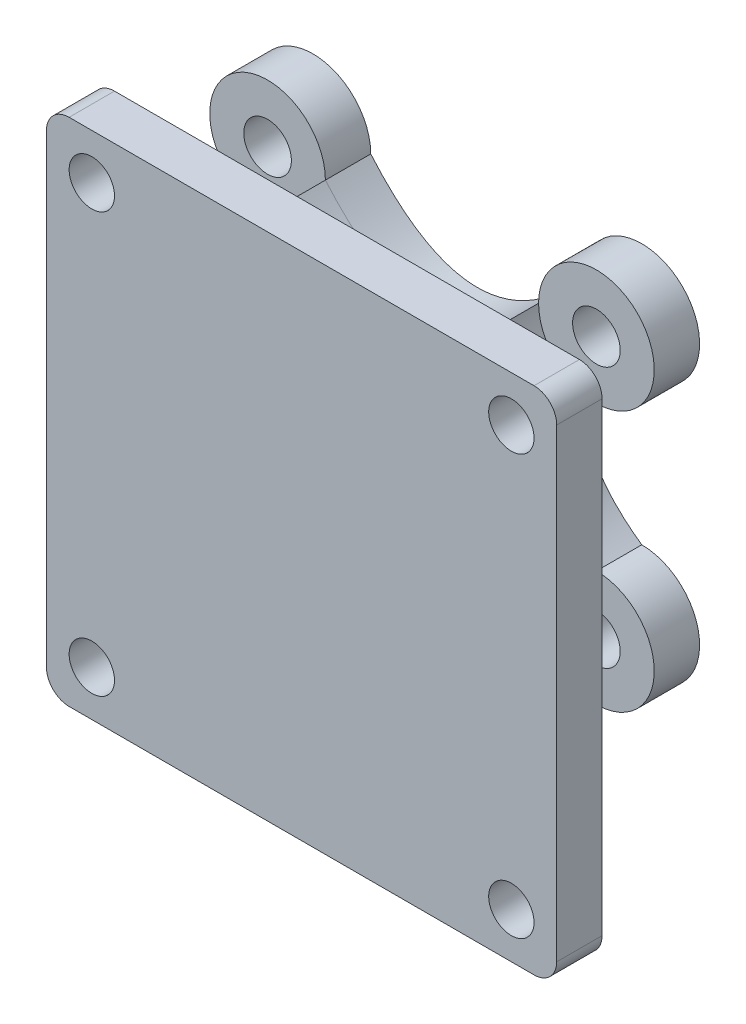
ISO-10303-21;
HEADER;
FILE_DESCRIPTION(('STEP AP214'),'2;1');
FILE_NAME('part.step','',(''),(''),'','','');
FILE_SCHEMA(('AUTOMOTIVE_DESIGN { 1 0 10303 214 1 1 1 1 }'));
ENDSEC;
DATA;
#1=APPLICATION_CONTEXT('core data for automotive mechanical design processes');
#2=APPLICATION_PROTOCOL_DEFINITION('international standard','automotive_design',2000,#1);
#3=PRODUCT_CONTEXT('',#1,'mechanical');
#4=PRODUCT('Part','Part','',(#3));
#5=PRODUCT_RELATED_PRODUCT_CATEGORY('part','',(#4));
#6=PRODUCT_DEFINITION_FORMATION('','',#4);
#7=PRODUCT_DEFINITION_CONTEXT('part definition',#1,'design');
#8=PRODUCT_DEFINITION('design','',#6,#7);
#9=PRODUCT_DEFINITION_SHAPE('','',#8);
#10=(LENGTH_UNIT() NAMED_UNIT(*) SI_UNIT(.MILLI.,.METRE.));
#11=(NAMED_UNIT(*) PLANE_ANGLE_UNIT() SI_UNIT($,.RADIAN.));
#12=(NAMED_UNIT(*) SI_UNIT($,.STERADIAN.) SOLID_ANGLE_UNIT());
#13=UNCERTAINTY_MEASURE_WITH_UNIT(LENGTH_MEASURE(1.E-05),#10,'distance_accuracy_value','');
#14=(GEOMETRIC_REPRESENTATION_CONTEXT(3) GLOBAL_UNCERTAINTY_ASSIGNED_CONTEXT((#13)) GLOBAL_UNIT_ASSIGNED_CONTEXT((#10,
#11,#12)) REPRESENTATION_CONTEXT('',''));
#15=CARTESIAN_POINT('',(0.,0.,0.));
#16=DIRECTION('',(0.,0.,1.));
#17=DIRECTION('',(1.,0.,0.));
#18=AXIS2_PLACEMENT_3D('',#15,#16,#17);
#19=CARTESIAN_POINT('',(0.,0.,4.));
#20=DIRECTION('',(0.,0.,1.));
#21=DIRECTION('',(1.,0.,0.));
#22=AXIS2_PLACEMENT_3D('',#19,#20,#21);
#23=PLANE('',#22);
#24=CARTESIAN_POINT('',(14.5,11.5,4.));
#25=DIRECTION('',(0.,0.,1.));
#26=DIRECTION('',(1.,0.,0.));
#27=AXIS2_PLACEMENT_3D('',#24,#25,#26);
#28=CIRCLE('',#27,2.1);
#29=CARTESIAN_POINT('',(16.6,11.5,4.));
#30=VERTEX_POINT('',#29);
#31=EDGE_CURVE('E265',#30,#30,#28,.T.);
#32=ORIENTED_EDGE('',*,*,#31,.F.);
#33=EDGE_LOOP('',(#32));
#34=FACE_BOUND('',#33,.T.);
#35=CARTESIAN_POINT('',(14.5,11.5,4.));
#36=DIRECTION('',(0.,0.,-1.));
#37=DIRECTION('',(1.,0.,0.));
#38=AXIS2_PLACEMENT_3D('',#35,#36,#37);
#39=CIRCLE('',#38,5.09999999093494);
#40=CARTESIAN_POINT('',(14.5,6.4,4.));
#41=VERTEX_POINT('',#40);
#42=CARTESIAN_POINT('',(9.4,11.5,4.));
#43=VERTEX_POINT('',#42);
#44=EDGE_CURVE('E124',#41,#43,#39,.T.);
#45=ORIENTED_EDGE('',*,*,#44,.F.);
#46=CARTESIAN_POINT('',(14.5,11.5,4.));
#47=DIRECTION('',(0.,0.,1.));
#48=DIRECTION('',(1.,0.,0.));
#49=AXIS2_PLACEMENT_3D('',#46,#47,#48);
#50=CIRCLE('',#49,5.1);
#51=EDGE_CURVE('E134',#41,#43,#50,.T.);
#52=ORIENTED_EDGE('',*,*,#51,.T.);
#53=EDGE_LOOP('',(#45,#52));
#54=FACE_BOUND('',#53,.T.);
#55=ADVANCED_FACE('F37',(#34,#54),#23,.T.);
#56=CARTESIAN_POINT('',(14.5,-11.5,4.));
#57=DIRECTION('',(0.,0.,1.));
#58=DIRECTION('',(1.,0.,0.));
#59=AXIS2_PLACEMENT_3D('',#56,#57,#58);
#60=CIRCLE('',#59,2.1);
#61=CARTESIAN_POINT('',(16.6,-11.5,4.));
#62=VERTEX_POINT('',#61);
#63=EDGE_CURVE('E256',#62,#62,#60,.T.);
#64=ORIENTED_EDGE('',*,*,#63,.F.);
#65=EDGE_LOOP('',(#64));
#66=FACE_BOUND('',#65,.T.);
#67=CARTESIAN_POINT('',(14.5,-11.5,4.));
#68=DIRECTION('',(0.,0.,-1.));
#69=DIRECTION('',(1.,0.,0.));
#70=AXIS2_PLACEMENT_3D('',#67,#68,#69);
#71=CIRCLE('',#70,5.10000000816288);
#72=CARTESIAN_POINT('',(9.4,-11.5,4.));
#73=VERTEX_POINT('',#72);
#74=CARTESIAN_POINT('',(14.5,-6.4,4.));
#75=VERTEX_POINT('',#74);
#76=EDGE_CURVE('E136',#73,#75,#71,.T.);
#77=ORIENTED_EDGE('',*,*,#76,.F.);
#78=CARTESIAN_POINT('',(14.5,-11.5,4.));
#79=DIRECTION('',(0.,0.,1.));
#80=DIRECTION('',(1.,0.,0.));
#81=AXIS2_PLACEMENT_3D('',#78,#79,#80);
#82=CIRCLE('',#81,5.1);
#83=EDGE_CURVE('E160',#73,#75,#82,.T.);
#84=ORIENTED_EDGE('',*,*,#83,.T.);
#85=EDGE_LOOP('',(#77,#84));
#86=FACE_BOUND('',#85,.T.);
#87=ADVANCED_FACE('F222',(#66,#86),#23,.T.);
#88=CARTESIAN_POINT('',(-14.5,-11.5,4.));
#89=DIRECTION('',(0.,0.,1.));
#90=DIRECTION('',(1.,0.,0.));
#91=AXIS2_PLACEMENT_3D('',#88,#89,#90);
#92=CIRCLE('',#91,2.1);
#93=CARTESIAN_POINT('',(-12.4,-11.5,4.));
#94=VERTEX_POINT('',#93);
#95=EDGE_CURVE('E262',#94,#94,#92,.T.);
#96=ORIENTED_EDGE('',*,*,#95,.F.);
#97=EDGE_LOOP('',(#96));
#98=FACE_BOUND('',#97,.T.);
#99=CARTESIAN_POINT('',(-14.5,-11.5,4.));
#100=DIRECTION('',(0.,0.,-1.));
#101=DIRECTION('',(1.,0.,0.));
#102=AXIS2_PLACEMENT_3D('',#99,#100,#101);
#103=CIRCLE('',#102,5.09999999093771);
#104=CARTESIAN_POINT('',(-14.5,-6.4,4.));
#105=VERTEX_POINT('',#104);
#106=CARTESIAN_POINT('',(-9.4,-11.5,4.));
#107=VERTEX_POINT('',#106);
#108=EDGE_CURVE('E391',#105,#107,#103,.T.);
#109=ORIENTED_EDGE('',*,*,#108,.F.);
#110=CARTESIAN_POINT('',(-14.5,-11.5,4.));
#111=DIRECTION('',(0.,0.,1.));
#112=DIRECTION('',(1.,0.,0.));
#113=AXIS2_PLACEMENT_3D('',#110,#111,#112);
#114=CIRCLE('',#113,5.1);
#115=EDGE_CURVE('E192',#105,#107,#114,.T.);
#116=ORIENTED_EDGE('',*,*,#115,.T.);
#117=EDGE_LOOP('',(#109,#116));
#118=FACE_BOUND('',#117,.T.);
#119=ADVANCED_FACE('F218',(#98,#118),#23,.T.);
#120=CARTESIAN_POINT('',(-14.5,11.5,4.));
#121=DIRECTION('',(0.,0.,1.));
#122=DIRECTION('',(1.,0.,0.));
#123=AXIS2_PLACEMENT_3D('',#120,#121,#122);
#124=CIRCLE('',#123,2.1);
#125=CARTESIAN_POINT('',(-12.4,11.5,4.));
#126=VERTEX_POINT('',#125);
#127=EDGE_CURVE('E317',#126,#126,#124,.T.);
#128=ORIENTED_EDGE('',*,*,#127,.F.);
#129=EDGE_LOOP('',(#128));
#130=FACE_BOUND('',#129,.T.);
#131=CARTESIAN_POINT('',(-14.5,11.5,4.));
#132=DIRECTION('',(0.,0.,-1.));
#133=DIRECTION('',(1.,0.,0.));
#134=AXIS2_PLACEMENT_3D('',#131,#132,#133);
#135=CIRCLE('',#134,5.1);
#136=CARTESIAN_POINT('',(-9.40000000000001,11.5,4.));
#137=VERTEX_POINT('',#136);
#138=CARTESIAN_POINT('',(-14.5,6.4,4.));
#139=VERTEX_POINT('',#138);
#140=EDGE_CURVE('E369',#137,#139,#135,.T.);
#141=ORIENTED_EDGE('',*,*,#140,.F.);
#142=CARTESIAN_POINT('',(-14.5,11.5,4.));
#143=DIRECTION('',(0.,0.,1.));
#144=DIRECTION('',(1.,0.,0.));
#145=AXIS2_PLACEMENT_3D('',#142,#143,#144);
#146=CIRCLE('',#145,5.1);
#147=EDGE_CURVE('E204',#137,#139,#146,.T.);
#148=ORIENTED_EDGE('',*,*,#147,.T.);
#149=EDGE_LOOP('',(#141,#148));
#150=FACE_BOUND('',#149,.T.);
#151=ADVANCED_FACE('F214',(#130,#150),#23,.T.);
#152=CARTESIAN_POINT('',(-14.5,11.5,4.));
#153=DIRECTION('',(0.,0.,-1.));
#154=DIRECTION('',(-1.,0.,0.));
#155=AXIS2_PLACEMENT_3D('',#152,#153,#154);
#156=CYLINDRICAL_SURFACE('',#155,5.1);
#157=CARTESIAN_POINT('',(-14.5,11.5,0.));
#158=DIRECTION('',(0.,0.,1.));
#159=DIRECTION('',(1.,0.,0.));
#160=AXIS2_PLACEMENT_3D('',#157,#158,#159);
#161=CIRCLE('',#160,5.1);
#162=CARTESIAN_POINT('',(-9.40000000000001,11.5,0.));
#163=VERTEX_POINT('',#162);
#164=CARTESIAN_POINT('',(-14.5,6.4,0.));
#165=VERTEX_POINT('',#164);
#166=EDGE_CURVE('E271',#163,#165,#161,.T.);
#167=ORIENTED_EDGE('',*,*,#166,.T.);
#168=DIRECTION('',(0.,0.,-1.));
#169=VECTOR('',#168,1.);
#170=CARTESIAN_POINT('',(-14.5,6.4,4.));
#171=LINE('',#170,#169);
#172=EDGE_CURVE('E45',#139,#165,#171,.T.);
#173=ORIENTED_EDGE('',*,*,#172,.F.);
#174=ORIENTED_EDGE('',*,*,#147,.F.);
#175=DIRECTION('',(0.,0.,-1.));
#176=VECTOR('',#175,1.);
#177=CARTESIAN_POINT('',(-9.40000000000001,11.5,4.));
#178=LINE('',#177,#176);
#179=EDGE_CURVE('E95',#137,#163,#178,.T.);
#180=ORIENTED_EDGE('',*,*,#179,.T.);
#181=EDGE_LOOP('',(#167,#173,#174,#180));
#182=FACE_BOUND('',#181,.T.);
#183=ADVANCED_FACE('F211',(#182),#156,.T.);
#184=CARTESIAN_POINT('',(-14.5,6.4,4.));
#185=CARTESIAN_POINT('',(-5.5,0.,4.));
#186=CARTESIAN_POINT('',(-14.5,-6.4,4.));
#187=B_SPLINE_CURVE_WITH_KNOTS('',2,(#184,#185,#186),.UNSPECIFIED.,.F.,.F.,(3,3),(0.,1.),.UNSPECIFIED.);
#188=DIRECTION('',(0.,0.,-1.));
#189=VECTOR('',#188,1.);
#190=SURFACE_OF_LINEAR_EXTRUSION('',#187,#189);
#191=CARTESIAN_POINT('',(-14.5,6.4,0.));
#192=CARTESIAN_POINT('',(-5.5,0.,0.));
#193=CARTESIAN_POINT('',(-14.5,-6.4,0.));
#194=B_SPLINE_CURVE_WITH_KNOTS('',2,(#191,#192,#193),.UNSPECIFIED.,.F.,.F.,(3,3),(0.,1.),.UNSPECIFIED.);
#195=CARTESIAN_POINT('',(-14.5,-6.4,0.));
#196=VERTEX_POINT('',#195);
#197=EDGE_CURVE('E273',#165,#196,#194,.T.);
#198=ORIENTED_EDGE('',*,*,#197,.T.);
#199=DIRECTION('',(0.,0.,-1.));
#200=VECTOR('',#199,1.);
#201=CARTESIAN_POINT('',(-14.5,-6.4,4.));
#202=LINE('',#201,#200);
#203=EDGE_CURVE('E327',#105,#196,#202,.T.);
#204=ORIENTED_EDGE('',*,*,#203,.F.);
#205=EDGE_CURVE('E198',#139,#105,#187,.T.);
#206=ORIENTED_EDGE('',*,*,#205,.F.);
#207=ORIENTED_EDGE('',*,*,#172,.T.);
#208=EDGE_LOOP('',(#198,#204,#206,#207));
#209=FACE_BOUND('',#208,.T.);
#210=ADVANCED_FACE('F209',(#209),#190,.F.);
#211=CARTESIAN_POINT('',(-14.5,-11.5,4.));
#212=DIRECTION('',(0.,0.,-1.));
#213=DIRECTION('',(-1.,0.,0.));
#214=AXIS2_PLACEMENT_3D('',#211,#212,#213);
#215=CYLINDRICAL_SURFACE('',#214,5.1);
#216=CARTESIAN_POINT('',(-14.5,-11.5,0.));
#217=DIRECTION('',(0.,0.,1.));
#218=DIRECTION('',(1.,0.,0.));
#219=AXIS2_PLACEMENT_3D('',#216,#217,#218);
#220=CIRCLE('',#219,5.1);
#221=CARTESIAN_POINT('',(-9.4,-11.5,0.));
#222=VERTEX_POINT('',#221);
#223=EDGE_CURVE('E277',#196,#222,#220,.T.);
#224=ORIENTED_EDGE('',*,*,#223,.T.);
#225=DIRECTION('',(0.,0.,-1.));
#226=VECTOR('',#225,1.);
#227=CARTESIAN_POINT('',(-9.4,-11.5,4.));
#228=LINE('',#227,#226);
#229=EDGE_CURVE('E324',#107,#222,#228,.T.);
#230=ORIENTED_EDGE('',*,*,#229,.F.);
#231=ORIENTED_EDGE('',*,*,#115,.F.);
#232=ORIENTED_EDGE('',*,*,#203,.T.);
#233=EDGE_LOOP('',(#224,#230,#231,#232));
#234=FACE_BOUND('',#233,.T.);
#235=ADVANCED_FACE('F184',(#234),#215,.T.);
#236=CARTESIAN_POINT('',(-9.4,-11.5,4.));
#237=CARTESIAN_POINT('',(0.,-0.499999999999993,4.));
#238=CARTESIAN_POINT('',(9.4,-11.5,4.));
#239=B_SPLINE_CURVE_WITH_KNOTS('',2,(#236,#237,#238),.UNSPECIFIED.,.F.,.F.,(3,3),(0.,1.),.UNSPECIFIED.);
#240=DIRECTION('',(0.,0.,-1.));
#241=VECTOR('',#240,1.);
#242=SURFACE_OF_LINEAR_EXTRUSION('',#239,#241);
#243=CARTESIAN_POINT('',(-9.4,-11.5,0.));
#244=CARTESIAN_POINT('',(0.,-0.499999999999993,0.));
#245=CARTESIAN_POINT('',(9.4,-11.5,0.));
#246=B_SPLINE_CURVE_WITH_KNOTS('',2,(#243,#244,#245),.UNSPECIFIED.,.F.,.F.,(3,3),(0.,1.),.UNSPECIFIED.);
#247=CARTESIAN_POINT('',(9.4,-11.5,0.));
#248=VERTEX_POINT('',#247);
#249=EDGE_CURVE('E282',#222,#248,#246,.T.);
#250=ORIENTED_EDGE('',*,*,#249,.T.);
#251=DIRECTION('',(0.,0.,-1.));
#252=VECTOR('',#251,1.);
#253=CARTESIAN_POINT('',(9.4,-11.5,4.));
#254=LINE('',#253,#252);
#255=EDGE_CURVE('E321',#73,#248,#254,.T.);
#256=ORIENTED_EDGE('',*,*,#255,.F.);
#257=EDGE_CURVE('E162',#107,#73,#239,.T.);
#258=ORIENTED_EDGE('',*,*,#257,.F.);
#259=ORIENTED_EDGE('',*,*,#229,.T.);
#260=EDGE_LOOP('',(#250,#256,#258,#259));
#261=FACE_BOUND('',#260,.T.);
#262=ADVANCED_FACE('F180',(#261),#242,.F.);
#263=CARTESIAN_POINT('',(14.5,-11.5,4.));
#264=DIRECTION('',(0.,0.,-1.));
#265=DIRECTION('',(-1.,0.,0.));
#266=AXIS2_PLACEMENT_3D('',#263,#264,#265);
#267=CYLINDRICAL_SURFACE('',#266,5.1);
#268=CARTESIAN_POINT('',(14.5,-11.5,0.));
#269=DIRECTION('',(0.,0.,1.));
#270=DIRECTION('',(1.,0.,0.));
#271=AXIS2_PLACEMENT_3D('',#268,#269,#270);
#272=CIRCLE('',#271,5.1);
#273=CARTESIAN_POINT('',(14.5,-6.4,0.));
#274=VERTEX_POINT('',#273);
#275=EDGE_CURVE('E286',#248,#274,#272,.T.);
#276=ORIENTED_EDGE('',*,*,#275,.T.);
#277=DIRECTION('',(0.,0.,-1.));
#278=VECTOR('',#277,1.);
#279=CARTESIAN_POINT('',(14.5,-6.4,4.));
#280=LINE('',#279,#278);
#281=EDGE_CURVE('E150',#75,#274,#280,.T.);
#282=ORIENTED_EDGE('',*,*,#281,.F.);
#283=ORIENTED_EDGE('',*,*,#83,.F.);
#284=ORIENTED_EDGE('',*,*,#255,.T.);
#285=EDGE_LOOP('',(#276,#282,#283,#284));
#286=FACE_BOUND('',#285,.T.);
#287=ADVANCED_FACE('F176',(#286),#267,.T.);
#288=CARTESIAN_POINT('',(14.5,6.4,4.));
#289=CARTESIAN_POINT('',(5.49999999999999,0.,4.));
#290=CARTESIAN_POINT('',(14.5,-6.39999999999999,4.));
#291=B_SPLINE_CURVE_WITH_KNOTS('',2,(#288,#289,#290),.UNSPECIFIED.,.F.,.F.,(3,3),(0.,1.),.UNSPECIFIED.);
#292=DIRECTION('',(0.,0.,-1.));
#293=VECTOR('',#292,1.);
#294=SURFACE_OF_LINEAR_EXTRUSION('',#291,#293);
#295=CARTESIAN_POINT('',(14.5,6.4,0.));
#296=CARTESIAN_POINT('',(5.49999999999999,0.,0.));
#297=CARTESIAN_POINT('',(14.5,-6.39999999999999,0.));
#298=B_SPLINE_CURVE_WITH_KNOTS('',2,(#295,#296,#297),.UNSPECIFIED.,.F.,.F.,(3,3),(0.,1.),.UNSPECIFIED.);
#299=CARTESIAN_POINT('',(14.5,6.4,0.));
#300=VERTEX_POINT('',#299);
#301=EDGE_CURVE('E146',#300,#274,#298,.T.);
#302=ORIENTED_EDGE('',*,*,#301,.F.);
#303=DIRECTION('',(0.,0.,-1.));
#304=VECTOR('',#303,1.);
#305=CARTESIAN_POINT('',(14.5,6.4,4.));
#306=LINE('',#305,#304);
#307=EDGE_CURVE('E141',#41,#300,#306,.T.);
#308=ORIENTED_EDGE('',*,*,#307,.F.);
#309=EDGE_CURVE('E143',#41,#75,#291,.T.);
#310=ORIENTED_EDGE('',*,*,#309,.T.);
#311=ORIENTED_EDGE('',*,*,#281,.T.);
#312=EDGE_LOOP('',(#302,#308,#310,#311));
#313=FACE_BOUND('',#312,.T.);
#314=ADVANCED_FACE('F142',(#313),#294,.T.);
#315=CARTESIAN_POINT('',(14.5,11.5,4.));
#316=DIRECTION('',(0.,0.,-1.));
#317=DIRECTION('',(-1.,0.,0.));
#318=AXIS2_PLACEMENT_3D('',#315,#316,#317);
#319=CYLINDRICAL_SURFACE('',#318,5.1);
#320=CARTESIAN_POINT('',(14.5,11.5,0.));
#321=DIRECTION('',(0.,0.,1.));
#322=DIRECTION('',(1.,0.,0.));
#323=AXIS2_PLACEMENT_3D('',#320,#321,#322);
#324=CIRCLE('',#323,5.1);
#325=CARTESIAN_POINT('',(9.4,11.5,0.));
#326=VERTEX_POINT('',#325);
#327=EDGE_CURVE('E295',#300,#326,#324,.T.);
#328=ORIENTED_EDGE('',*,*,#327,.T.);
#329=DIRECTION('',(0.,0.,-1.));
#330=VECTOR('',#329,1.);
#331=CARTESIAN_POINT('',(9.4,11.5,4.));
#332=LINE('',#331,#330);
#333=EDGE_CURVE('E151',#43,#326,#332,.T.);
#334=ORIENTED_EDGE('',*,*,#333,.F.);
#335=ORIENTED_EDGE('',*,*,#51,.F.);
#336=ORIENTED_EDGE('',*,*,#307,.T.);
#337=EDGE_LOOP('',(#328,#334,#335,#336));
#338=FACE_BOUND('',#337,.T.);
#339=ADVANCED_FACE('F153',(#338),#319,.T.);
#340=CARTESIAN_POINT('',(-14.5,-11.5,4.));
#341=DIRECTION('',(0.,0.,-1.));
#342=DIRECTION('',(-1.,0.,0.));
#343=AXIS2_PLACEMENT_3D('',#340,#341,#342);
#344=CYLINDRICAL_SURFACE('',#343,2.1);
#345=ORIENTED_EDGE('',*,*,#95,.T.);
#346=EDGE_LOOP('',(#345));
#347=FACE_BOUND('',#346,.T.);
#348=CARTESIAN_POINT('',(-14.5,-11.5,0.));
#349=DIRECTION('',(0.,0.,1.));
#350=DIRECTION('',(1.,0.,0.));
#351=AXIS2_PLACEMENT_3D('',#348,#349,#350);
#352=CIRCLE('',#351,2.1);
#353=CARTESIAN_POINT('',(-12.4,-11.5,0.));
#354=VERTEX_POINT('',#353);
#355=EDGE_CURVE('E311',#354,#354,#352,.T.);
#356=ORIENTED_EDGE('',*,*,#355,.F.);
#357=EDGE_LOOP('',(#356));
#358=FACE_BOUND('',#357,.T.);
#359=ADVANCED_FACE('F242',(#347,#358),#344,.F.);
#360=CARTESIAN_POINT('',(14.5,-11.5,4.));
#361=DIRECTION('',(0.,0.,-1.));
#362=DIRECTION('',(-1.,0.,0.));
#363=AXIS2_PLACEMENT_3D('',#360,#361,#362);
#364=CYLINDRICAL_SURFACE('',#363,2.1);
#365=ORIENTED_EDGE('',*,*,#63,.T.);
#366=EDGE_LOOP('',(#365));
#367=FACE_BOUND('',#366,.T.);
#368=CARTESIAN_POINT('',(14.5,-11.5,0.));
#369=DIRECTION('',(0.,0.,1.));
#370=DIRECTION('',(1.,0.,0.));
#371=AXIS2_PLACEMENT_3D('',#368,#369,#370);
#372=CIRCLE('',#371,2.1);
#373=CARTESIAN_POINT('',(16.6,-11.5,0.));
#374=VERTEX_POINT('',#373);
#375=EDGE_CURVE('E305',#374,#374,#372,.T.);
#376=ORIENTED_EDGE('',*,*,#375,.F.);
#377=EDGE_LOOP('',(#376));
#378=FACE_BOUND('',#377,.T.);
#379=ADVANCED_FACE('F245',(#367,#378),#364,.F.);
#380=CARTESIAN_POINT('',(-9.4,11.5,4.));
#381=CARTESIAN_POINT('',(0.,0.5,4.));
#382=CARTESIAN_POINT('',(9.4,11.5,4.));
#383=B_SPLINE_CURVE_WITH_KNOTS('',2,(#380,#381,#382),.UNSPECIFIED.,.F.,.F.,(3,3),(0.,1.),.UNSPECIFIED.);
#384=DIRECTION('',(0.,0.,-1.));
#385=VECTOR('',#384,1.);
#386=SURFACE_OF_LINEAR_EXTRUSION('',#383,#385);
#387=CARTESIAN_POINT('',(-9.4,11.5,0.));
#388=CARTESIAN_POINT('',(0.,0.5,0.));
#389=CARTESIAN_POINT('',(9.4,11.5,0.));
#390=B_SPLINE_CURVE_WITH_KNOTS('',2,(#387,#388,#389),.UNSPECIFIED.,.F.,.F.,(3,3),(0.,1.),.UNSPECIFIED.);
#391=EDGE_CURVE('E300',#163,#326,#390,.T.);
#392=ORIENTED_EDGE('',*,*,#391,.F.);
#393=ORIENTED_EDGE('',*,*,#179,.F.);
#394=EDGE_CURVE('E155',#137,#43,#383,.T.);
#395=ORIENTED_EDGE('',*,*,#394,.T.);
#396=ORIENTED_EDGE('',*,*,#333,.T.);
#397=EDGE_LOOP('',(#392,#393,#395,#396));
#398=FACE_BOUND('',#397,.T.);
#399=ADVANCED_FACE('F248',(#398),#386,.T.);
#400=CARTESIAN_POINT('',(-14.5,11.5,4.));
#401=DIRECTION('',(0.,0.,-1.));
#402=DIRECTION('',(-1.,0.,0.));
#403=AXIS2_PLACEMENT_3D('',#400,#401,#402);
#404=CYLINDRICAL_SURFACE('',#403,2.1);
#405=ORIENTED_EDGE('',*,*,#127,.T.);
#406=EDGE_LOOP('',(#405));
#407=FACE_BOUND('',#406,.T.);
#408=CARTESIAN_POINT('',(-14.5,11.5,0.));
#409=DIRECTION('',(0.,0.,1.));
#410=DIRECTION('',(1.,0.,0.));
#411=AXIS2_PLACEMENT_3D('',#408,#409,#410);
#412=CIRCLE('',#411,2.1);
#413=CARTESIAN_POINT('',(-12.4,11.5,0.));
#414=VERTEX_POINT('',#413);
#415=EDGE_CURVE('E268',#414,#414,#412,.T.);
#416=ORIENTED_EDGE('',*,*,#415,.F.);
#417=EDGE_LOOP('',(#416));
#418=FACE_BOUND('',#417,.T.);
#419=ADVANCED_FACE('F39',(#407,#418),#404,.F.);
#420=CARTESIAN_POINT('',(14.5,11.5,4.));
#421=DIRECTION('',(0.,0.,-1.));
#422=DIRECTION('',(-1.,0.,0.));
#423=AXIS2_PLACEMENT_3D('',#420,#421,#422);
#424=CYLINDRICAL_SURFACE('',#423,2.1);
#425=ORIENTED_EDGE('',*,*,#31,.T.);
#426=EDGE_LOOP('',(#425));
#427=FACE_BOUND('',#426,.T.);
#428=CARTESIAN_POINT('',(14.5,11.5,0.));
#429=DIRECTION('',(0.,0.,1.));
#430=DIRECTION('',(1.,0.,0.));
#431=AXIS2_PLACEMENT_3D('',#428,#429,#430);
#432=CIRCLE('',#431,2.1);
#433=CARTESIAN_POINT('',(16.6,11.5,0.));
#434=VERTEX_POINT('',#433);
#435=EDGE_CURVE('E314',#434,#434,#432,.T.);
#436=ORIENTED_EDGE('',*,*,#435,.F.);
#437=EDGE_LOOP('',(#436));
#438=FACE_BOUND('',#437,.T.);
#439=ADVANCED_FACE('F237',(#427,#438),#424,.F.);
#440=CARTESIAN_POINT('',(0.,0.,0.));
#441=DIRECTION('',(0.,0.,1.));
#442=DIRECTION('',(1.,0.,0.));
#443=AXIS2_PLACEMENT_3D('',#440,#441,#442);
#444=PLANE('',#443);
#445=ORIENTED_EDGE('',*,*,#415,.T.);
#446=EDGE_LOOP('',(#445));
#447=FACE_BOUND('',#446,.T.);
#448=ORIENTED_EDGE('',*,*,#166,.F.);
#449=ORIENTED_EDGE('',*,*,#391,.T.);
#450=ORIENTED_EDGE('',*,*,#327,.F.);
#451=ORIENTED_EDGE('',*,*,#301,.T.);
#452=ORIENTED_EDGE('',*,*,#275,.F.);
#453=ORIENTED_EDGE('',*,*,#249,.F.);
#454=ORIENTED_EDGE('',*,*,#223,.F.);
#455=ORIENTED_EDGE('',*,*,#197,.F.);
#456=EDGE_LOOP('',(#448,#449,#450,#451,#452,#453,#454,#455));
#457=FACE_BOUND('',#456,.T.);
#458=ORIENTED_EDGE('',*,*,#375,.T.);
#459=EDGE_LOOP('',(#458));
#460=FACE_BOUND('',#459,.T.);
#461=ORIENTED_EDGE('',*,*,#355,.T.);
#462=EDGE_LOOP('',(#461));
#463=FACE_BOUND('',#462,.T.);
#464=ORIENTED_EDGE('',*,*,#435,.T.);
#465=EDGE_LOOP('',(#464));
#466=FACE_BOUND('',#465,.T.);
#467=ADVANCED_FACE('F234',(#447,#457,#460,#463,#466),#444,.F.);
#468=CARTESIAN_POINT('',(4008.17346747329,1000006.,15.5));
#469=CARTESIAN_POINT('',(2.37143638059933E-10,-999994.,15.5));
#470=CARTESIAN_POINT('',(-4008.17346747376,1000006.,15.5));
#471=B_SPLINE_CURVE_WITH_KNOTS('',2,(#468,#469,#470),.UNSPECIFIED.,.F.,.F.,(3,3),(0.,1.),.UNSPECIFIED.);
#472=DIRECTION('',(0.,0.,-1.));
#473=VECTOR('',#472,1.);
#474=SURFACE_OF_LINEAR_EXTRUSION('',#471,#473);
#475=DIRECTION('',(0.,0.,-1.));
#476=VECTOR('',#475,1.);
#477=CARTESIAN_POINT('',(-9.40000000000001,11.5,15.5));
#478=LINE('',#477,#476);
#479=CARTESIAN_POINT('',(-9.40000000000001,11.5,11.5));
#480=VERTEX_POINT('',#479);
#481=EDGE_CURVE('E60',#480,#137,#478,.T.);
#482=ORIENTED_EDGE('',*,*,#481,.F.);
#483=CARTESIAN_POINT('',(4008.17346747329,1000006.,11.5));
#484=CARTESIAN_POINT('',(2.37143638059933E-10,-999994.,11.5));
#485=CARTESIAN_POINT('',(-4008.17346747376,1000006.,11.5));
#486=B_SPLINE_CURVE_WITH_KNOTS('',2,(#483,#484,#485),.UNSPECIFIED.,.F.,.F.,(3,3),(0.,1.),.UNSPECIFIED.);
#487=CARTESIAN_POINT('',(9.40000000906506,11.5,11.5));
#488=VERTEX_POINT('',#487);
#489=EDGE_CURVE('E374',#480,#488,#486,.F.);
#490=ORIENTED_EDGE('',*,*,#489,.T.);
#491=DIRECTION('',(0.,0.,-1.));
#492=VECTOR('',#491,1.);
#493=CARTESIAN_POINT('',(9.40000000906506,11.5,15.5));
#494=LINE('',#493,#492);
#495=EDGE_CURVE('E128',#488,#43,#494,.T.);
#496=ORIENTED_EDGE('',*,*,#495,.T.);
#497=ORIENTED_EDGE('',*,*,#394,.F.);
#498=EDGE_LOOP('',(#482,#490,#496,#497));
#499=FACE_BOUND('',#498,.T.);
#500=ADVANCED_FACE('F231',(#499),#474,.F.);
#501=CARTESIAN_POINT('',(-14.5,11.5,15.5));
#502=DIRECTION('',(0.,0.,-1.));
#503=DIRECTION('',(-1.,0.,0.));
#504=AXIS2_PLACEMENT_3D('',#501,#502,#503);
#505=CYLINDRICAL_SURFACE('',#504,5.1);
#506=DIRECTION('',(0.,0.,-1.));
#507=VECTOR('',#506,1.);
#508=CARTESIAN_POINT('',(-14.5,6.4,15.5));
#509=LINE('',#508,#507);
#510=CARTESIAN_POINT('',(-14.5000000000262,6.39999999996288,11.5));
#511=VERTEX_POINT('',#510);
#512=EDGE_CURVE('E355',#511,#139,#509,.T.);
#513=ORIENTED_EDGE('',*,*,#512,.F.);
#514=CARTESIAN_POINT('',(-14.5,11.5,11.5));
#515=DIRECTION('',(0.,0.,-1.));
#516=DIRECTION('',(-1.,0.,0.));
#517=AXIS2_PLACEMENT_3D('',#514,#515,#516);
#518=CIRCLE('',#517,5.1);
#519=EDGE_CURVE('E401',#511,#480,#518,.F.);
#520=ORIENTED_EDGE('',*,*,#519,.T.);
#521=ORIENTED_EDGE('',*,*,#481,.T.);
#522=ORIENTED_EDGE('',*,*,#140,.T.);
#523=EDGE_LOOP('',(#513,#520,#521,#522));
#524=FACE_BOUND('',#523,.T.);
#525=ADVANCED_FACE('F403',(#524),#505,.F.);
#526=CARTESIAN_POINT('',(-1000010.,3016.98893305878,15.5));
#527=CARTESIAN_POINT('',(999990.,-3.50386386571699E-10,15.5));
#528=CARTESIAN_POINT('',(-1000010.,-3016.98893305813,15.5));
#529=B_SPLINE_CURVE_WITH_KNOTS('',2,(#526,#527,#528),.UNSPECIFIED.,.F.,.F.,(3,3),(0.,1.),.UNSPECIFIED.);
#530=DIRECTION('',(0.,0.,-1.));
#531=VECTOR('',#530,1.);
#532=SURFACE_OF_LINEAR_EXTRUSION('',#529,#531);
#533=DIRECTION('',(0.,0.,-1.));
#534=VECTOR('',#533,1.);
#535=CARTESIAN_POINT('',(-14.500000050955,-6.40000003620489,15.5));
#536=LINE('',#535,#534);
#537=CARTESIAN_POINT('',(-14.500000050955,-6.40000000906229,11.5));
#538=VERTEX_POINT('',#537);
#539=EDGE_CURVE('E104',#538,#105,#536,.T.);
#540=ORIENTED_EDGE('',*,*,#539,.F.);
#541=CARTESIAN_POINT('',(-1000010.,3016.98893305878,11.5));
#542=CARTESIAN_POINT('',(999990.,-3.50386386571699E-10,11.5));
#543=CARTESIAN_POINT('',(-1000010.,-3016.98893305813,11.5));
#544=B_SPLINE_CURVE_WITH_KNOTS('',2,(#541,#542,#543),.UNSPECIFIED.,.F.,.F.,(3,3),(0.,1.),.UNSPECIFIED.);
#545=EDGE_CURVE('E358',#538,#511,#544,.F.);
#546=ORIENTED_EDGE('',*,*,#545,.T.);
#547=ORIENTED_EDGE('',*,*,#512,.T.);
#548=ORIENTED_EDGE('',*,*,#205,.T.);
#549=EDGE_LOOP('',(#540,#546,#547,#548));
#550=FACE_BOUND('',#549,.T.);
#551=ADVANCED_FACE('F351',(#550),#532,.F.);
#552=CARTESIAN_POINT('',(-14.5,-11.5,15.5));
#553=DIRECTION('',(0.,0.,-1.));
#554=DIRECTION('',(-1.,0.,0.));
#555=AXIS2_PLACEMENT_3D('',#552,#553,#554);
#556=CYLINDRICAL_SURFACE('',#555,5.09999999093771);
#557=DIRECTION('',(0.,0.,-1.));
#558=VECTOR('',#557,1.);
#559=CARTESIAN_POINT('',(-9.40000000906229,-11.5,15.5));
#560=LINE('',#559,#558);
#561=CARTESIAN_POINT('',(-9.4000000038309,-11.5000000044709,11.5));
#562=VERTEX_POINT('',#561);
#563=EDGE_CURVE('E362',#562,#107,#560,.T.);
#564=ORIENTED_EDGE('',*,*,#563,.F.);
#565=CARTESIAN_POINT('',(-14.5,-11.5,11.5));
#566=DIRECTION('',(0.,0.,-1.));
#567=DIRECTION('',(-1.,0.,0.));
#568=AXIS2_PLACEMENT_3D('',#565,#566,#567);
#569=CIRCLE('',#568,5.09999999093771);
#570=EDGE_CURVE('E390',#562,#538,#569,.F.);
#571=ORIENTED_EDGE('',*,*,#570,.T.);
#572=ORIENTED_EDGE('',*,*,#539,.T.);
#573=ORIENTED_EDGE('',*,*,#108,.T.);
#574=EDGE_LOOP('',(#564,#571,#572,#573));
#575=FACE_BOUND('',#574,.T.);
#576=ADVANCED_FACE('F388',(#575),#556,.F.);
#577=CARTESIAN_POINT('',(-4008.17346747984,-1000006.,15.5));
#578=CARTESIAN_POINT('',(4.18332035678759E-10,999994.,15.5));
#579=CARTESIAN_POINT('',(4008.17346747909,-1000006.,15.5));
#580=B_SPLINE_CURVE_WITH_KNOTS('',2,(#577,#578,#579),.UNSPECIFIED.,.F.,.F.,(3,3),(0.,1.),.UNSPECIFIED.);
#581=DIRECTION('',(0.,0.,-1.));
#582=VECTOR('',#581,1.);
#583=SURFACE_OF_LINEAR_EXTRUSION('',#580,#582);
#584=DIRECTION('',(0.,0.,-1.));
#585=VECTOR('',#584,1.);
#586=CARTESIAN_POINT('',(9.3999999673261,-11.4999999616963,15.5));
#587=LINE('',#586,#585);
#588=CARTESIAN_POINT('',(9.39999999183712,-11.5,11.5));
#589=VERTEX_POINT('',#588);
#590=EDGE_CURVE('E379',#589,#73,#587,.T.);
#591=ORIENTED_EDGE('',*,*,#590,.F.);
#592=CARTESIAN_POINT('',(-4008.17346747984,-1000006.,11.5));
#593=CARTESIAN_POINT('',(4.18332035678759E-10,999994.,11.5));
#594=CARTESIAN_POINT('',(4008.17346747909,-1000006.,11.5));
#595=B_SPLINE_CURVE_WITH_KNOTS('',2,(#592,#593,#594),.UNSPECIFIED.,.F.,.F.,(3,3),(0.,1.),.UNSPECIFIED.);
#596=EDGE_CURVE('E387',#589,#562,#595,.F.);
#597=ORIENTED_EDGE('',*,*,#596,.T.);
#598=ORIENTED_EDGE('',*,*,#563,.T.);
#599=ORIENTED_EDGE('',*,*,#257,.T.);
#600=EDGE_LOOP('',(#591,#597,#598,#599));
#601=FACE_BOUND('',#600,.T.);
#602=ADVANCED_FACE('F384',(#601),#583,.F.);
#603=CARTESIAN_POINT('',(14.5,-11.5,15.5));
#604=DIRECTION('',(0.,0.,-1.));
#605=DIRECTION('',(-1.,0.,0.));
#606=AXIS2_PLACEMENT_3D('',#603,#604,#605);
#607=CYLINDRICAL_SURFACE('',#606,5.10000000816288);
#608=DIRECTION('',(0.,0.,-1.));
#609=VECTOR('',#608,1.);
#610=CARTESIAN_POINT('',(14.5,-6.39999999183712,15.5));
#611=LINE('',#610,#609);
#612=CARTESIAN_POINT('',(14.4999999961712,-6.3999999972213,11.5));
#613=VERTEX_POINT('',#612);
#614=EDGE_CURVE('E127',#613,#75,#611,.T.);
#615=ORIENTED_EDGE('',*,*,#614,.F.);
#616=CARTESIAN_POINT('',(14.5,-11.5,11.5));
#617=DIRECTION('',(0.,0.,-1.));
#618=DIRECTION('',(-1.,0.,0.));
#619=AXIS2_PLACEMENT_3D('',#616,#617,#618);
#620=CIRCLE('',#619,5.10000000816288);
#621=EDGE_CURVE('E742',#613,#589,#620,.F.);
#622=ORIENTED_EDGE('',*,*,#621,.T.);
#623=ORIENTED_EDGE('',*,*,#590,.T.);
#624=ORIENTED_EDGE('',*,*,#76,.T.);
#625=EDGE_LOOP('',(#615,#622,#623,#624));
#626=FACE_BOUND('',#625,.T.);
#627=ADVANCED_FACE('F558',(#626),#607,.F.);
#628=CARTESIAN_POINT('',(1000010.,-3016.98893305805,15.5));
#629=CARTESIAN_POINT('',(-999990.,-4.20108392518159E-10,15.5));
#630=CARTESIAN_POINT('',(1000010.,3016.98893305894,15.5));
#631=B_SPLINE_CURVE_WITH_KNOTS('',2,(#628,#629,#630),.UNSPECIFIED.,.F.,.F.,(3,3),(0.,1.),.UNSPECIFIED.);
#632=DIRECTION('',(0.,0.,-1.));
#633=VECTOR('',#632,1.);
#634=SURFACE_OF_LINEAR_EXTRUSION('',#631,#633);
#635=DIRECTION('',(0.,0.,-1.));
#636=VECTOR('',#635,1.);
#637=CARTESIAN_POINT('',(14.5000000509417,6.40000003619601,15.5));
#638=LINE('',#637,#636);
#639=CARTESIAN_POINT('',(14.5000000509417,6.40000003619601,11.5));
#640=VERTEX_POINT('',#639);
#641=EDGE_CURVE('E120',#640,#41,#638,.T.);
#642=ORIENTED_EDGE('',*,*,#641,.F.);
#643=CARTESIAN_POINT('',(1000010.,-3016.98893305805,11.5));
#644=CARTESIAN_POINT('',(-999990.,-4.20108392518159E-10,11.5));
#645=CARTESIAN_POINT('',(1000010.,3016.98893305894,11.5));
#646=B_SPLINE_CURVE_WITH_KNOTS('',2,(#643,#644,#645),.UNSPECIFIED.,.F.,.F.,(3,3),(0.,1.),.UNSPECIFIED.);
#647=EDGE_CURVE('E52',#640,#613,#646,.F.);
#648=ORIENTED_EDGE('',*,*,#647,.T.);
#649=ORIENTED_EDGE('',*,*,#614,.T.);
#650=ORIENTED_EDGE('',*,*,#309,.F.);
#651=EDGE_LOOP('',(#642,#648,#649,#650));
#652=FACE_BOUND('',#651,.T.);
#653=ADVANCED_FACE('F157',(#652),#634,.F.);
#654=CARTESIAN_POINT('',(14.5,11.5,15.5));
#655=DIRECTION('',(0.,0.,-1.));
#656=DIRECTION('',(-1.,0.,0.));
#657=AXIS2_PLACEMENT_3D('',#654,#655,#656);
#658=CYLINDRICAL_SURFACE('',#657,5.09999999093494);
#659=ORIENTED_EDGE('',*,*,#495,.F.);
#660=CARTESIAN_POINT('',(14.5,11.5,11.5));
#661=DIRECTION('',(0.,0.,-1.));
#662=DIRECTION('',(-1.,0.,0.));
#663=AXIS2_PLACEMENT_3D('',#660,#661,#662);
#664=CIRCLE('',#663,5.09999999093494);
#665=EDGE_CURVE('E11',#488,#640,#664,.F.);
#666=ORIENTED_EDGE('',*,*,#665,.T.);
#667=ORIENTED_EDGE('',*,*,#641,.T.);
#668=ORIENTED_EDGE('',*,*,#44,.T.);
#669=EDGE_LOOP('',(#659,#666,#667,#668));
#670=FACE_BOUND('',#669,.T.);
#671=ADVANCED_FACE('F123',(#670),#658,.F.);
#672=CARTESIAN_POINT('',(20.5,14.5,11.5));
#673=DIRECTION('',(0.,0.,-1.));
#674=DIRECTION('',(-1.,0.,0.));
#675=AXIS2_PLACEMENT_3D('',#672,#673,#674);
#676=PLANE('',#675);
#677=CARTESIAN_POINT('',(20.5,14.5,11.5));
#678=DIRECTION('',(0.,0.,1.));
#679=DIRECTION('',(-1.,0.,0.));
#680=AXIS2_PLACEMENT_3D('',#677,#678,#679);
#681=CIRCLE('',#680,2.);
#682=CARTESIAN_POINT('',(22.5,14.5,11.5));
#683=VERTEX_POINT('',#682);
#684=CARTESIAN_POINT('',(20.5,16.5,11.5));
#685=VERTEX_POINT('',#684);
#686=EDGE_CURVE('E785',#683,#685,#681,.T.);
#687=ORIENTED_EDGE('',*,*,#686,.F.);
#688=DIRECTION('',(0.,1.,0.));
#689=VECTOR('',#688,1.);
#690=CARTESIAN_POINT('',(22.5,14.5,11.5));
#691=LINE('',#690,#689);
#692=CARTESIAN_POINT('',(22.5,-26.5,11.5));
#693=VERTEX_POINT('',#692);
#694=EDGE_CURVE('E762',#693,#683,#691,.T.);
#695=ORIENTED_EDGE('',*,*,#694,.F.);
#696=CARTESIAN_POINT('',(20.5,-26.5,11.5));
#697=DIRECTION('',(0.,0.,1.));
#698=DIRECTION('',(1.,0.,0.));
#699=AXIS2_PLACEMENT_3D('',#696,#697,#698);
#700=CIRCLE('',#699,2.);
#701=CARTESIAN_POINT('',(20.5,-28.5,11.5));
#702=VERTEX_POINT('',#701);
#703=EDGE_CURVE('E810',#702,#693,#700,.T.);
#704=ORIENTED_EDGE('',*,*,#703,.F.);
#705=DIRECTION('',(1.,0.,0.));
#706=VECTOR('',#705,1.);
#707=CARTESIAN_POINT('',(-20.5,-28.5,11.5));
#708=LINE('',#707,#706);
#709=CARTESIAN_POINT('',(-20.5,-28.5,11.5));
#710=VERTEX_POINT('',#709);
#711=EDGE_CURVE('E813',#710,#702,#708,.T.);
#712=ORIENTED_EDGE('',*,*,#711,.F.);
#713=CARTESIAN_POINT('',(-20.5,-26.5,11.5));
#714=DIRECTION('',(0.,0.,1.));
#715=DIRECTION('',(1.,0.,0.));
#716=AXIS2_PLACEMENT_3D('',#713,#714,#715);
#717=CIRCLE('',#716,2.);
#718=CARTESIAN_POINT('',(-22.5,-26.5,11.5));
#719=VERTEX_POINT('',#718);
#720=EDGE_CURVE('E816',#719,#710,#717,.T.);
#721=ORIENTED_EDGE('',*,*,#720,.F.);
#722=DIRECTION('',(0.,-1.,0.));
#723=VECTOR('',#722,1.);
#724=CARTESIAN_POINT('',(-22.5,14.5,11.5));
#725=LINE('',#724,#723);
#726=CARTESIAN_POINT('',(-22.5,14.5,11.5));
#727=VERTEX_POINT('',#726);
#728=EDGE_CURVE('E819',#727,#719,#725,.T.);
#729=ORIENTED_EDGE('',*,*,#728,.F.);
#730=CARTESIAN_POINT('',(-20.5,14.5,11.5));
#731=DIRECTION('',(0.,0.,1.));
#732=DIRECTION('',(1.,0.,0.));
#733=AXIS2_PLACEMENT_3D('',#730,#731,#732);
#734=CIRCLE('',#733,2.);
#735=CARTESIAN_POINT('',(-20.5,16.5,11.5));
#736=VERTEX_POINT('',#735);
#737=EDGE_CURVE('E822',#736,#727,#734,.T.);
#738=ORIENTED_EDGE('',*,*,#737,.F.);
#739=DIRECTION('',(-1.,0.,0.));
#740=VECTOR('',#739,1.);
#741=CARTESIAN_POINT('',(-20.5,16.5,11.5));
#742=LINE('',#741,#740);
#743=EDGE_CURVE('E825',#685,#736,#742,.T.);
#744=ORIENTED_EDGE('',*,*,#743,.F.);
#745=EDGE_LOOP('',(#687,#695,#704,#712,#721,#729,#738,#744));
#746=FACE_BOUND('',#745,.T.);
#747=CARTESIAN_POINT('',(-18.5,12.5,11.5));
#748=DIRECTION('',(0.,0.,1.));
#749=DIRECTION('',(1.,0.,0.));
#750=AXIS2_PLACEMENT_3D('',#747,#748,#749);
#751=CIRCLE('',#750,2.);
#752=CARTESIAN_POINT('',(-16.5,12.5,11.5));
#753=VERTEX_POINT('',#752);
#754=EDGE_CURVE('E807',#753,#753,#751,.T.);
#755=ORIENTED_EDGE('',*,*,#754,.T.);
#756=EDGE_LOOP('',(#755));
#757=FACE_BOUND('',#756,.T.);
#758=CARTESIAN_POINT('',(-18.5,-24.5,11.5));
#759=DIRECTION('',(0.,0.,1.));
#760=DIRECTION('',(1.,0.,0.));
#761=AXIS2_PLACEMENT_3D('',#758,#759,#760);
#762=CIRCLE('',#761,2.);
#763=CARTESIAN_POINT('',(-16.5,-24.5,11.5));
#764=VERTEX_POINT('',#763);
#765=EDGE_CURVE('E833',#764,#764,#762,.T.);
#766=ORIENTED_EDGE('',*,*,#765,.T.);
#767=EDGE_LOOP('',(#766));
#768=FACE_BOUND('',#767,.T.);
#769=CARTESIAN_POINT('',(18.5,-24.5,11.5));
#770=DIRECTION('',(0.,0.,1.));
#771=DIRECTION('',(1.,0.,0.));
#772=AXIS2_PLACEMENT_3D('',#769,#770,#771);
#773=CIRCLE('',#772,2.);
#774=CARTESIAN_POINT('',(20.5,-24.5,11.5));
#775=VERTEX_POINT('',#774);
#776=EDGE_CURVE('E839',#775,#775,#773,.T.);
#777=ORIENTED_EDGE('',*,*,#776,.T.);
#778=EDGE_LOOP('',(#777));
#779=FACE_BOUND('',#778,.T.);
#780=CARTESIAN_POINT('',(18.5,12.5,11.5));
#781=DIRECTION('',(0.,0.,1.));
#782=DIRECTION('',(1.,0.,0.));
#783=AXIS2_PLACEMENT_3D('',#780,#781,#782);
#784=CIRCLE('',#783,2.);
#785=CARTESIAN_POINT('',(20.5,12.5,11.5));
#786=VERTEX_POINT('',#785);
#787=EDGE_CURVE('E845',#786,#786,#784,.T.);
#788=ORIENTED_EDGE('',*,*,#787,.T.);
#789=EDGE_LOOP('',(#788));
#790=FACE_BOUND('',#789,.T.);
#791=ORIENTED_EDGE('',*,*,#489,.F.);
#792=ORIENTED_EDGE('',*,*,#519,.F.);
#793=ORIENTED_EDGE('',*,*,#545,.F.);
#794=ORIENTED_EDGE('',*,*,#570,.F.);
#795=ORIENTED_EDGE('',*,*,#596,.F.);
#796=ORIENTED_EDGE('',*,*,#621,.F.);
#797=ORIENTED_EDGE('',*,*,#647,.F.);
#798=ORIENTED_EDGE('',*,*,#665,.F.);
#799=EDGE_LOOP('',(#791,#792,#793,#794,#795,#796,#797,#798));
#800=FACE_BOUND('',#799,.T.);
#801=ADVANCED_FACE('F400',(#746,#757,#768,#779,#790,#800),#676,.T.);
#802=CARTESIAN_POINT('',(20.5,14.5,11.5));
#803=DIRECTION('',(0.,0.,1.));
#804=DIRECTION('',(1.,0.,0.));
#805=AXIS2_PLACEMENT_3D('',#802,#803,#804);
#806=CYLINDRICAL_SURFACE('',#805,2.);
#807=CARTESIAN_POINT('',(20.5,14.5,15.5));
#808=DIRECTION('',(0.,0.,1.));
#809=DIRECTION('',(-1.,0.,0.));
#810=AXIS2_PLACEMENT_3D('',#807,#808,#809);
#811=CIRCLE('',#810,2.);
#812=CARTESIAN_POINT('',(22.5,14.5,15.5));
#813=VERTEX_POINT('',#812);
#814=CARTESIAN_POINT('',(20.5,16.5,15.5));
#815=VERTEX_POINT('',#814);
#816=EDGE_CURVE('E804',#813,#815,#811,.T.);
#817=ORIENTED_EDGE('',*,*,#816,.F.);
#818=DIRECTION('',(0.,0.,1.));
#819=VECTOR('',#818,1.);
#820=CARTESIAN_POINT('',(22.5,14.5,11.5));
#821=LINE('',#820,#819);
#822=EDGE_CURVE('E745',#683,#813,#821,.T.);
#823=ORIENTED_EDGE('',*,*,#822,.F.);
#824=ORIENTED_EDGE('',*,*,#686,.T.);
#825=DIRECTION('',(0.,0.,1.));
#826=VECTOR('',#825,1.);
#827=CARTESIAN_POINT('',(20.5,16.5,11.5));
#828=LINE('',#827,#826);
#829=EDGE_CURVE('E755',#685,#815,#828,.T.);
#830=ORIENTED_EDGE('',*,*,#829,.T.);
#831=EDGE_LOOP('',(#817,#823,#824,#830));
#832=FACE_BOUND('',#831,.T.);
#833=ADVANCED_FACE('F600',(#832),#806,.T.);
#834=CARTESIAN_POINT('',(22.5,14.5,11.5));
#835=DIRECTION('',(1.,0.,0.));
#836=DIRECTION('',(0.,1.,0.));
#837=AXIS2_PLACEMENT_3D('',#834,#835,#836);
#838=PLANE('',#837);
#839=DIRECTION('',(0.,1.,0.));
#840=VECTOR('',#839,1.);
#841=CARTESIAN_POINT('',(22.5,14.5,15.5));
#842=LINE('',#841,#840);
#843=CARTESIAN_POINT('',(22.5,-26.5,15.5));
#844=VERTEX_POINT('',#843);
#845=EDGE_CURVE('E782',#844,#813,#842,.T.);
#846=ORIENTED_EDGE('',*,*,#845,.F.);
#847=DIRECTION('',(0.,0.,1.));
#848=VECTOR('',#847,1.);
#849=CARTESIAN_POINT('',(22.5,-26.5,11.5));
#850=LINE('',#849,#848);
#851=EDGE_CURVE('E777',#693,#844,#850,.T.);
#852=ORIENTED_EDGE('',*,*,#851,.F.);
#853=ORIENTED_EDGE('',*,*,#694,.T.);
#854=ORIENTED_EDGE('',*,*,#822,.T.);
#855=EDGE_LOOP('',(#846,#852,#853,#854));
#856=FACE_BOUND('',#855,.T.);
#857=ADVANCED_FACE('F609',(#856),#838,.T.);
#858=CARTESIAN_POINT('',(20.5,-26.5,11.5));
#859=DIRECTION('',(0.,0.,1.));
#860=DIRECTION('',(1.,0.,0.));
#861=AXIS2_PLACEMENT_3D('',#858,#859,#860);
#862=CYLINDRICAL_SURFACE('',#861,2.);
#863=CARTESIAN_POINT('',(20.5,-26.5,15.5));
#864=DIRECTION('',(0.,0.,1.));
#865=DIRECTION('',(1.,0.,0.));
#866=AXIS2_PLACEMENT_3D('',#863,#864,#865);
#867=CIRCLE('',#866,2.);
#868=CARTESIAN_POINT('',(20.5,-28.5,15.5));
#869=VERTEX_POINT('',#868);
#870=EDGE_CURVE('E786',#869,#844,#867,.T.);
#871=ORIENTED_EDGE('',*,*,#870,.F.);
#872=DIRECTION('',(0.,0.,1.));
#873=VECTOR('',#872,1.);
#874=CARTESIAN_POINT('',(20.5,-28.5,11.5));
#875=LINE('',#874,#873);
#876=EDGE_CURVE('E774',#702,#869,#875,.T.);
#877=ORIENTED_EDGE('',*,*,#876,.F.);
#878=ORIENTED_EDGE('',*,*,#703,.T.);
#879=ORIENTED_EDGE('',*,*,#851,.T.);
#880=EDGE_LOOP('',(#871,#877,#878,#879));
#881=FACE_BOUND('',#880,.T.);
#882=ADVANCED_FACE('F618',(#881),#862,.T.);
#883=CARTESIAN_POINT('',(-20.5,-28.5,11.5));
#884=DIRECTION('',(0.,-1.,0.));
#885=DIRECTION('',(0.,0.,-1.));
#886=AXIS2_PLACEMENT_3D('',#883,#884,#885);
#887=PLANE('',#886);
#888=DIRECTION('',(1.,0.,0.));
#889=VECTOR('',#888,1.);
#890=CARTESIAN_POINT('',(-20.5,-28.5,15.5));
#891=LINE('',#890,#889);
#892=CARTESIAN_POINT('',(-20.5,-28.5,15.5));
#893=VERTEX_POINT('',#892);
#894=EDGE_CURVE('E789',#893,#869,#891,.T.);
#895=ORIENTED_EDGE('',*,*,#894,.F.);
#896=DIRECTION('',(0.,0.,1.));
#897=VECTOR('',#896,1.);
#898=CARTESIAN_POINT('',(-20.5,-28.5,11.5));
#899=LINE('',#898,#897);
#900=EDGE_CURVE('E771',#710,#893,#899,.T.);
#901=ORIENTED_EDGE('',*,*,#900,.F.);
#902=ORIENTED_EDGE('',*,*,#711,.T.);
#903=ORIENTED_EDGE('',*,*,#876,.T.);
#904=EDGE_LOOP('',(#895,#901,#902,#903));
#905=FACE_BOUND('',#904,.T.);
#906=ADVANCED_FACE('F627',(#905),#887,.T.);
#907=CARTESIAN_POINT('',(-20.5,-26.5,11.5));
#908=DIRECTION('',(0.,0.,1.));
#909=DIRECTION('',(1.,0.,0.));
#910=AXIS2_PLACEMENT_3D('',#907,#908,#909);
#911=CYLINDRICAL_SURFACE('',#910,2.);
#912=CARTESIAN_POINT('',(-20.5,-26.5,15.5));
#913=DIRECTION('',(0.,0.,1.));
#914=DIRECTION('',(1.,0.,0.));
#915=AXIS2_PLACEMENT_3D('',#912,#913,#914);
#916=CIRCLE('',#915,2.);
#917=CARTESIAN_POINT('',(-22.5,-26.5,15.5));
#918=VERTEX_POINT('',#917);
#919=EDGE_CURVE('E792',#918,#893,#916,.T.);
#920=ORIENTED_EDGE('',*,*,#919,.F.);
#921=DIRECTION('',(0.,0.,1.));
#922=VECTOR('',#921,1.);
#923=CARTESIAN_POINT('',(-22.5,-26.5,11.5));
#924=LINE('',#923,#922);
#925=EDGE_CURVE('E768',#719,#918,#924,.T.);
#926=ORIENTED_EDGE('',*,*,#925,.F.);
#927=ORIENTED_EDGE('',*,*,#720,.T.);
#928=ORIENTED_EDGE('',*,*,#900,.T.);
#929=EDGE_LOOP('',(#920,#926,#927,#928));
#930=FACE_BOUND('',#929,.T.);
#931=ADVANCED_FACE('F636',(#930),#911,.T.);
#932=CARTESIAN_POINT('',(-22.5,14.5,11.5));
#933=DIRECTION('',(-1.,0.,0.));
#934=DIRECTION('',(0.,-1.,0.));
#935=AXIS2_PLACEMENT_3D('',#932,#933,#934);
#936=PLANE('',#935);
#937=DIRECTION('',(0.,-1.,0.));
#938=VECTOR('',#937,1.);
#939=CARTESIAN_POINT('',(-22.5,14.5,15.5));
#940=LINE('',#939,#938);
#941=CARTESIAN_POINT('',(-22.5,14.5,15.5));
#942=VERTEX_POINT('',#941);
#943=EDGE_CURVE('E795',#942,#918,#940,.T.);
#944=ORIENTED_EDGE('',*,*,#943,.F.);
#945=DIRECTION('',(0.,0.,1.));
#946=VECTOR('',#945,1.);
#947=CARTESIAN_POINT('',(-22.5,14.5,11.5));
#948=LINE('',#947,#946);
#949=EDGE_CURVE('E765',#727,#942,#948,.T.);
#950=ORIENTED_EDGE('',*,*,#949,.F.);
#951=ORIENTED_EDGE('',*,*,#728,.T.);
#952=ORIENTED_EDGE('',*,*,#925,.T.);
#953=EDGE_LOOP('',(#944,#950,#951,#952));
#954=FACE_BOUND('',#953,.T.);
#955=ADVANCED_FACE('F645',(#954),#936,.T.);
#956=CARTESIAN_POINT('',(-20.5,14.5,11.5));
#957=DIRECTION('',(0.,0.,1.));
#958=DIRECTION('',(1.,0.,0.));
#959=AXIS2_PLACEMENT_3D('',#956,#957,#958);
#960=CYLINDRICAL_SURFACE('',#959,2.);
#961=CARTESIAN_POINT('',(-20.5,14.5,15.5));
#962=DIRECTION('',(0.,0.,1.));
#963=DIRECTION('',(1.,0.,0.));
#964=AXIS2_PLACEMENT_3D('',#961,#962,#963);
#965=CIRCLE('',#964,2.);
#966=CARTESIAN_POINT('',(-20.5,16.5,15.5));
#967=VERTEX_POINT('',#966);
#968=EDGE_CURVE('E798',#967,#942,#965,.T.);
#969=ORIENTED_EDGE('',*,*,#968,.F.);
#970=DIRECTION('',(0.,0.,1.));
#971=VECTOR('',#970,1.);
#972=CARTESIAN_POINT('',(-20.5,16.5,11.5));
#973=LINE('',#972,#971);
#974=EDGE_CURVE('E761',#736,#967,#973,.T.);
#975=ORIENTED_EDGE('',*,*,#974,.F.);
#976=ORIENTED_EDGE('',*,*,#737,.T.);
#977=ORIENTED_EDGE('',*,*,#949,.T.);
#978=EDGE_LOOP('',(#969,#975,#976,#977));
#979=FACE_BOUND('',#978,.T.);
#980=ADVANCED_FACE('F654',(#979),#960,.T.);
#981=CARTESIAN_POINT('',(-20.5,16.5,11.5));
#982=DIRECTION('',(0.,1.,0.));
#983=DIRECTION('',(0.,0.,1.));
#984=AXIS2_PLACEMENT_3D('',#981,#982,#983);
#985=PLANE('',#984);
#986=DIRECTION('',(-1.,0.,0.));
#987=VECTOR('',#986,1.);
#988=CARTESIAN_POINT('',(-20.5,16.5,15.5));
#989=LINE('',#988,#987);
#990=EDGE_CURVE('E801',#815,#967,#989,.T.);
#991=ORIENTED_EDGE('',*,*,#990,.F.);
#992=ORIENTED_EDGE('',*,*,#829,.F.);
#993=ORIENTED_EDGE('',*,*,#743,.T.);
#994=ORIENTED_EDGE('',*,*,#974,.T.);
#995=EDGE_LOOP('',(#991,#992,#993,#994));
#996=FACE_BOUND('',#995,.T.);
#997=ADVANCED_FACE('F663',(#996),#985,.T.);
#998=CARTESIAN_POINT('',(-18.5,12.5,11.5));
#999=DIRECTION('',(0.,0.,1.));
#1000=DIRECTION('',(1.,0.,0.));
#1001=AXIS2_PLACEMENT_3D('',#998,#999,#1000);
#1002=CYLINDRICAL_SURFACE('',#1001,2.);
#1003=ORIENTED_EDGE('',*,*,#754,.F.);
#1004=EDGE_LOOP('',(#1003));
#1005=FACE_BOUND('',#1004,.T.);
#1006=CARTESIAN_POINT('',(-18.5,12.5,15.5));
#1007=DIRECTION('',(0.,0.,1.));
#1008=DIRECTION('',(1.,0.,0.));
#1009=AXIS2_PLACEMENT_3D('',#1006,#1007,#1008);
#1010=CIRCLE('',#1009,2.);
#1011=CARTESIAN_POINT('',(-16.5,12.5,15.5));
#1012=VERTEX_POINT('',#1011);
#1013=EDGE_CURVE('E830',#1012,#1012,#1010,.T.);
#1014=ORIENTED_EDGE('',*,*,#1013,.T.);
#1015=EDGE_LOOP('',(#1014));
#1016=FACE_BOUND('',#1015,.T.);
#1017=ADVANCED_FACE('F672',(#1005,#1016),#1002,.F.);
#1018=CARTESIAN_POINT('',(-18.5,-24.5,11.5));
#1019=DIRECTION('',(0.,0.,1.));
#1020=DIRECTION('',(1.,0.,0.));
#1021=AXIS2_PLACEMENT_3D('',#1018,#1019,#1020);
#1022=CYLINDRICAL_SURFACE('',#1021,2.);
#1023=ORIENTED_EDGE('',*,*,#765,.F.);
#1024=EDGE_LOOP('',(#1023));
#1025=FACE_BOUND('',#1024,.T.);
#1026=CARTESIAN_POINT('',(-18.5,-24.5,15.5));
#1027=DIRECTION('',(0.,0.,1.));
#1028=DIRECTION('',(1.,0.,0.));
#1029=AXIS2_PLACEMENT_3D('',#1026,#1027,#1028);
#1030=CIRCLE('',#1029,2.);
#1031=CARTESIAN_POINT('',(-16.5,-24.5,15.5));
#1032=VERTEX_POINT('',#1031);
#1033=EDGE_CURVE('E836',#1032,#1032,#1030,.T.);
#1034=ORIENTED_EDGE('',*,*,#1033,.T.);
#1035=EDGE_LOOP('',(#1034));
#1036=FACE_BOUND('',#1035,.T.);
#1037=ADVANCED_FACE('F681',(#1025,#1036),#1022,.F.);
#1038=CARTESIAN_POINT('',(18.5,-24.5,11.5));
#1039=DIRECTION('',(0.,0.,1.));
#1040=DIRECTION('',(1.,0.,0.));
#1041=AXIS2_PLACEMENT_3D('',#1038,#1039,#1040);
#1042=CYLINDRICAL_SURFACE('',#1041,2.);
#1043=ORIENTED_EDGE('',*,*,#776,.F.);
#1044=EDGE_LOOP('',(#1043));
#1045=FACE_BOUND('',#1044,.T.);
#1046=CARTESIAN_POINT('',(18.5,-24.5,15.5));
#1047=DIRECTION('',(0.,0.,1.));
#1048=DIRECTION('',(1.,0.,0.));
#1049=AXIS2_PLACEMENT_3D('',#1046,#1047,#1048);
#1050=CIRCLE('',#1049,2.);
#1051=CARTESIAN_POINT('',(20.5,-24.5,15.5));
#1052=VERTEX_POINT('',#1051);
#1053=EDGE_CURVE('E842',#1052,#1052,#1050,.T.);
#1054=ORIENTED_EDGE('',*,*,#1053,.T.);
#1055=EDGE_LOOP('',(#1054));
#1056=FACE_BOUND('',#1055,.T.);
#1057=ADVANCED_FACE('F690',(#1045,#1056),#1042,.F.);
#1058=CARTESIAN_POINT('',(18.5,12.5,11.5));
#1059=DIRECTION('',(0.,0.,1.));
#1060=DIRECTION('',(1.,0.,0.));
#1061=AXIS2_PLACEMENT_3D('',#1058,#1059,#1060);
#1062=CYLINDRICAL_SURFACE('',#1061,2.);
#1063=ORIENTED_EDGE('',*,*,#787,.F.);
#1064=EDGE_LOOP('',(#1063));
#1065=FACE_BOUND('',#1064,.T.);
#1066=CARTESIAN_POINT('',(18.5,12.5,15.5));
#1067=DIRECTION('',(0.,0.,1.));
#1068=DIRECTION('',(1.,0.,0.));
#1069=AXIS2_PLACEMENT_3D('',#1066,#1067,#1068);
#1070=CIRCLE('',#1069,2.);
#1071=CARTESIAN_POINT('',(20.5,12.5,15.5));
#1072=VERTEX_POINT('',#1071);
#1073=EDGE_CURVE('E848',#1072,#1072,#1070,.T.);
#1074=ORIENTED_EDGE('',*,*,#1073,.T.);
#1075=EDGE_LOOP('',(#1074));
#1076=FACE_BOUND('',#1075,.T.);
#1077=ADVANCED_FACE('F589',(#1065,#1076),#1062,.F.);
#1078=CARTESIAN_POINT('',(6.66133814775094E-13,5.99999999997181,15.5));
#1079=DIRECTION('',(0.,0.,1.));
#1080=DIRECTION('',(1.,0.,0.));
#1081=AXIS2_PLACEMENT_3D('',#1078,#1079,#1080);
#1082=PLANE('',#1081);
#1083=ORIENTED_EDGE('',*,*,#1073,.F.);
#1084=EDGE_LOOP('',(#1083));
#1085=FACE_BOUND('',#1084,.T.);
#1086=ORIENTED_EDGE('',*,*,#1053,.F.);
#1087=EDGE_LOOP('',(#1086));
#1088=FACE_BOUND('',#1087,.T.);
#1089=ORIENTED_EDGE('',*,*,#1033,.F.);
#1090=EDGE_LOOP('',(#1089));
#1091=FACE_BOUND('',#1090,.T.);
#1092=ORIENTED_EDGE('',*,*,#1013,.F.);
#1093=EDGE_LOOP('',(#1092));
#1094=FACE_BOUND('',#1093,.T.);
#1095=ORIENTED_EDGE('',*,*,#816,.T.);
#1096=ORIENTED_EDGE('',*,*,#990,.T.);
#1097=ORIENTED_EDGE('',*,*,#968,.T.);
#1098=ORIENTED_EDGE('',*,*,#943,.T.);
#1099=ORIENTED_EDGE('',*,*,#919,.T.);
#1100=ORIENTED_EDGE('',*,*,#894,.T.);
#1101=ORIENTED_EDGE('',*,*,#870,.T.);
#1102=ORIENTED_EDGE('',*,*,#845,.T.);
#1103=EDGE_LOOP('',(#1095,#1096,#1097,#1098,#1099,#1100,#1101,#1102));
#1104=FACE_BOUND('',#1103,.T.);
#1105=ADVANCED_FACE('F583',(#1085,#1088,#1091,#1094,#1104),#1082,.T.);
#1106=CLOSED_SHELL('',(#55,#87,#119,#151,#183,#210,#235,#262,#287,#314,#339,#359,#379,#399,#419,
#439,#467,#500,#525,#551,#576,#602,#627,#653,#671,#801,#833,#857,#882,#906,#931,#955,#980,#997,
#1017,#1037,#1057,#1077,#1105));
#1107=MANIFOLD_SOLID_BREP('B2',#1106);
#1108=ADVANCED_BREP_SHAPE_REPRESENTATION('',(#18,#1107),#14);
#1109=SHAPE_DEFINITION_REPRESENTATION(#9,#1108);
ENDSEC;
END-ISO-10303-21;
